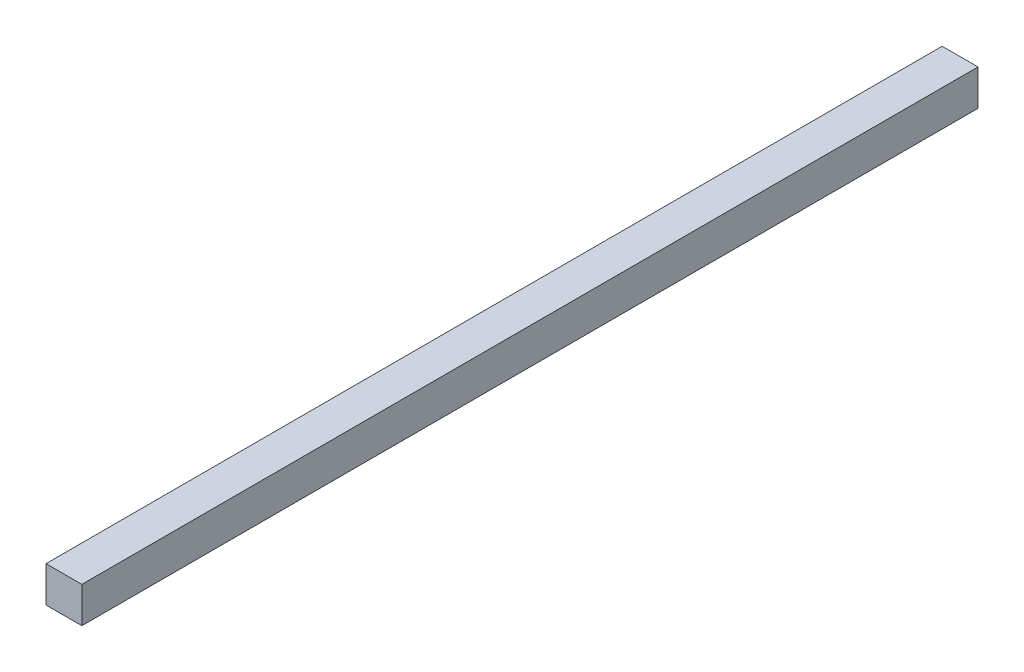
ISO-10303-21;
HEADER;
FILE_DESCRIPTION(('STEP AP214'),'2;1');
FILE_NAME('part.step','',(''),(''),'','','');
FILE_SCHEMA(('AUTOMOTIVE_DESIGN { 1 0 10303 214 1 1 1 1 }'));
ENDSEC;
DATA;
#1=APPLICATION_CONTEXT('core data for automotive mechanical design processes');
#2=APPLICATION_PROTOCOL_DEFINITION('international standard','automotive_design',2000,#1);
#3=PRODUCT_CONTEXT('',#1,'mechanical');
#4=PRODUCT('Part','Part','',(#3));
#5=PRODUCT_RELATED_PRODUCT_CATEGORY('part','',(#4));
#6=PRODUCT_DEFINITION_FORMATION('','',#4);
#7=PRODUCT_DEFINITION_CONTEXT('part definition',#1,'design');
#8=PRODUCT_DEFINITION('design','',#6,#7);
#9=PRODUCT_DEFINITION_SHAPE('','',#8);
#10=(LENGTH_UNIT() NAMED_UNIT(*) SI_UNIT(.MILLI.,.METRE.));
#11=(NAMED_UNIT(*) PLANE_ANGLE_UNIT() SI_UNIT($,.RADIAN.));
#12=(NAMED_UNIT(*) SI_UNIT($,.STERADIAN.) SOLID_ANGLE_UNIT());
#13=UNCERTAINTY_MEASURE_WITH_UNIT(LENGTH_MEASURE(1.E-05),#10,'distance_accuracy_value','');
#14=(GEOMETRIC_REPRESENTATION_CONTEXT(3) GLOBAL_UNCERTAINTY_ASSIGNED_CONTEXT((#13)) GLOBAL_UNIT_ASSIGNED_CONTEXT((#10,
#11,#12)) REPRESENTATION_CONTEXT('',''));
#15=CARTESIAN_POINT('',(0.,0.,0.));
#16=DIRECTION('',(0.,0.,1.));
#17=DIRECTION('',(1.,0.,0.));
#18=AXIS2_PLACEMENT_3D('',#15,#16,#17);
#19=CARTESIAN_POINT('',(0.,0.,1000.));
#20=DIRECTION('',(0.,0.,1.));
#21=DIRECTION('',(1.,0.,0.));
#22=AXIS2_PLACEMENT_3D('',#19,#20,#21);
#23=PLANE('',#22);
#24=DIRECTION('',(-1.,0.,0.));
#25=VECTOR('',#24,1.);
#26=CARTESIAN_POINT('',(-20.,20.,1000.));
#27=LINE('',#26,#25);
#28=CARTESIAN_POINT('',(20.,20.,1000.));
#29=VERTEX_POINT('',#28);
#30=CARTESIAN_POINT('',(-20.,20.,1000.));
#31=VERTEX_POINT('',#30);
#32=EDGE_CURVE('E11',#29,#31,#27,.T.);
#33=ORIENTED_EDGE('',*,*,#32,.T.);
#34=DIRECTION('',(0.,-1.,0.));
#35=VECTOR('',#34,1.);
#36=CARTESIAN_POINT('',(-20.,-20.,1000.));
#37=LINE('',#36,#35);
#38=CARTESIAN_POINT('',(-20.,-20.,1000.));
#39=VERTEX_POINT('',#38);
#40=EDGE_CURVE('E96',#31,#39,#37,.T.);
#41=ORIENTED_EDGE('',*,*,#40,.T.);
#42=DIRECTION('',(1.,0.,0.));
#43=VECTOR('',#42,1.);
#44=CARTESIAN_POINT('',(20.,-20.,1000.));
#45=LINE('',#44,#43);
#46=CARTESIAN_POINT('',(20.,-20.,1000.));
#47=VERTEX_POINT('',#46);
#48=EDGE_CURVE('E73',#39,#47,#45,.T.);
#49=ORIENTED_EDGE('',*,*,#48,.T.);
#50=DIRECTION('',(0.,1.,0.));
#51=VECTOR('',#50,1.);
#52=CARTESIAN_POINT('',(20.,20.,1000.));
#53=LINE('',#52,#51);
#54=EDGE_CURVE('E71',#47,#29,#53,.T.);
#55=ORIENTED_EDGE('',*,*,#54,.T.);
#56=EDGE_LOOP('',(#33,#41,#49,#55));
#57=FACE_BOUND('',#56,.T.);
#58=ADVANCED_FACE('F17',(#57),#23,.T.);
#59=CARTESIAN_POINT('',(0.,0.,0.));
#60=DIRECTION('',(0.,0.,1.));
#61=DIRECTION('',(1.,0.,0.));
#62=AXIS2_PLACEMENT_3D('',#59,#60,#61);
#63=PLANE('',#62);
#64=DIRECTION('',(1.,0.,0.));
#65=VECTOR('',#64,1.);
#66=CARTESIAN_POINT('',(-20.,20.,0.));
#67=LINE('',#66,#65);
#68=CARTESIAN_POINT('',(-20.,20.,0.));
#69=VERTEX_POINT('',#68);
#70=CARTESIAN_POINT('',(20.,20.,0.));
#71=VERTEX_POINT('',#70);
#72=EDGE_CURVE('E28',#69,#71,#67,.T.);
#73=ORIENTED_EDGE('',*,*,#72,.T.);
#74=DIRECTION('',(0.,-1.,0.));
#75=VECTOR('',#74,1.);
#76=CARTESIAN_POINT('',(20.,20.,0.));
#77=LINE('',#76,#75);
#78=CARTESIAN_POINT('',(20.,-20.,0.));
#79=VERTEX_POINT('',#78);
#80=EDGE_CURVE('E82',#71,#79,#77,.T.);
#81=ORIENTED_EDGE('',*,*,#80,.T.);
#82=DIRECTION('',(-1.,0.,0.));
#83=VECTOR('',#82,1.);
#84=CARTESIAN_POINT('',(20.,-20.,0.));
#85=LINE('',#84,#83);
#86=CARTESIAN_POINT('',(-20.,-20.,0.));
#87=VERTEX_POINT('',#86);
#88=EDGE_CURVE('E99',#79,#87,#85,.T.);
#89=ORIENTED_EDGE('',*,*,#88,.T.);
#90=DIRECTION('',(0.,1.,0.));
#91=VECTOR('',#90,1.);
#92=CARTESIAN_POINT('',(-20.,-20.,0.));
#93=LINE('',#92,#91);
#94=EDGE_CURVE('E105',#87,#69,#93,.T.);
#95=ORIENTED_EDGE('',*,*,#94,.T.);
#96=EDGE_LOOP('',(#73,#81,#89,#95));
#97=FACE_BOUND('',#96,.T.);
#98=ADVANCED_FACE('F19',(#97),#63,.F.);
#99=CARTESIAN_POINT('',(20.,20.,0.));
#100=DIRECTION('',(0.,1.,0.));
#101=DIRECTION('',(1.,0.,0.));
#102=AXIS2_PLACEMENT_3D('',#99,#100,#101);
#103=PLANE('',#102);
#104=ORIENTED_EDGE('',*,*,#72,.F.);
#105=DIRECTION('',(0.,0.,1.));
#106=VECTOR('',#105,1.);
#107=CARTESIAN_POINT('',(-20.,20.,0.));
#108=LINE('',#107,#106);
#109=EDGE_CURVE('E68',#69,#31,#108,.T.);
#110=ORIENTED_EDGE('',*,*,#109,.T.);
#111=ORIENTED_EDGE('',*,*,#32,.F.);
#112=DIRECTION('',(0.,0.,1.));
#113=VECTOR('',#112,1.);
#114=CARTESIAN_POINT('',(20.,20.,0.));
#115=LINE('',#114,#113);
#116=EDGE_CURVE('E21',#71,#29,#115,.T.);
#117=ORIENTED_EDGE('',*,*,#116,.F.);
#118=EDGE_LOOP('',(#104,#110,#111,#117));
#119=FACE_BOUND('',#118,.T.);
#120=ADVANCED_FACE('F64',(#119),#103,.T.);
#121=CARTESIAN_POINT('',(-20.,20.,0.));
#122=DIRECTION('',(-1.,0.,0.));
#123=DIRECTION('',(0.,0.,1.));
#124=AXIS2_PLACEMENT_3D('',#121,#122,#123);
#125=PLANE('',#124);
#126=ORIENTED_EDGE('',*,*,#94,.F.);
#127=DIRECTION('',(0.,0.,1.));
#128=VECTOR('',#127,1.);
#129=CARTESIAN_POINT('',(-20.,-20.,0.));
#130=LINE('',#129,#128);
#131=EDGE_CURVE('E98',#87,#39,#130,.T.);
#132=ORIENTED_EDGE('',*,*,#131,.T.);
#133=ORIENTED_EDGE('',*,*,#40,.F.);
#134=ORIENTED_EDGE('',*,*,#109,.F.);
#135=EDGE_LOOP('',(#126,#132,#133,#134));
#136=FACE_BOUND('',#135,.T.);
#137=ADVANCED_FACE('F118',(#136),#125,.T.);
#138=CARTESIAN_POINT('',(-20.,-20.,0.));
#139=DIRECTION('',(0.,-1.,0.));
#140=DIRECTION('',(0.,0.,-1.));
#141=AXIS2_PLACEMENT_3D('',#138,#139,#140);
#142=PLANE('',#141);
#143=ORIENTED_EDGE('',*,*,#88,.F.);
#144=DIRECTION('',(0.,0.,1.));
#145=VECTOR('',#144,1.);
#146=CARTESIAN_POINT('',(20.,-20.,0.));
#147=LINE('',#146,#145);
#148=EDGE_CURVE('E78',#79,#47,#147,.T.);
#149=ORIENTED_EDGE('',*,*,#148,.T.);
#150=ORIENTED_EDGE('',*,*,#48,.F.);
#151=ORIENTED_EDGE('',*,*,#131,.F.);
#152=EDGE_LOOP('',(#143,#149,#150,#151));
#153=FACE_BOUND('',#152,.T.);
#154=ADVANCED_FACE('F120',(#153),#142,.T.);
#155=CARTESIAN_POINT('',(20.,-20.,0.));
#156=DIRECTION('',(1.,0.,0.));
#157=DIRECTION('',(0.,1.,0.));
#158=AXIS2_PLACEMENT_3D('',#155,#156,#157);
#159=PLANE('',#158);
#160=ORIENTED_EDGE('',*,*,#80,.F.);
#161=ORIENTED_EDGE('',*,*,#116,.T.);
#162=ORIENTED_EDGE('',*,*,#54,.F.);
#163=ORIENTED_EDGE('',*,*,#148,.F.);
#164=EDGE_LOOP('',(#160,#161,#162,#163));
#165=FACE_BOUND('',#164,.T.);
#166=ADVANCED_FACE('F80',(#165),#159,.T.);
#167=CLOSED_SHELL('',(#58,#98,#120,#137,#154,#166));
#168=MANIFOLD_SOLID_BREP('B1',#167);
#169=ADVANCED_BREP_SHAPE_REPRESENTATION('',(#18,#168),#14);
#170=SHAPE_DEFINITION_REPRESENTATION(#9,#169);
ENDSEC;
END-ISO-10303-21;
